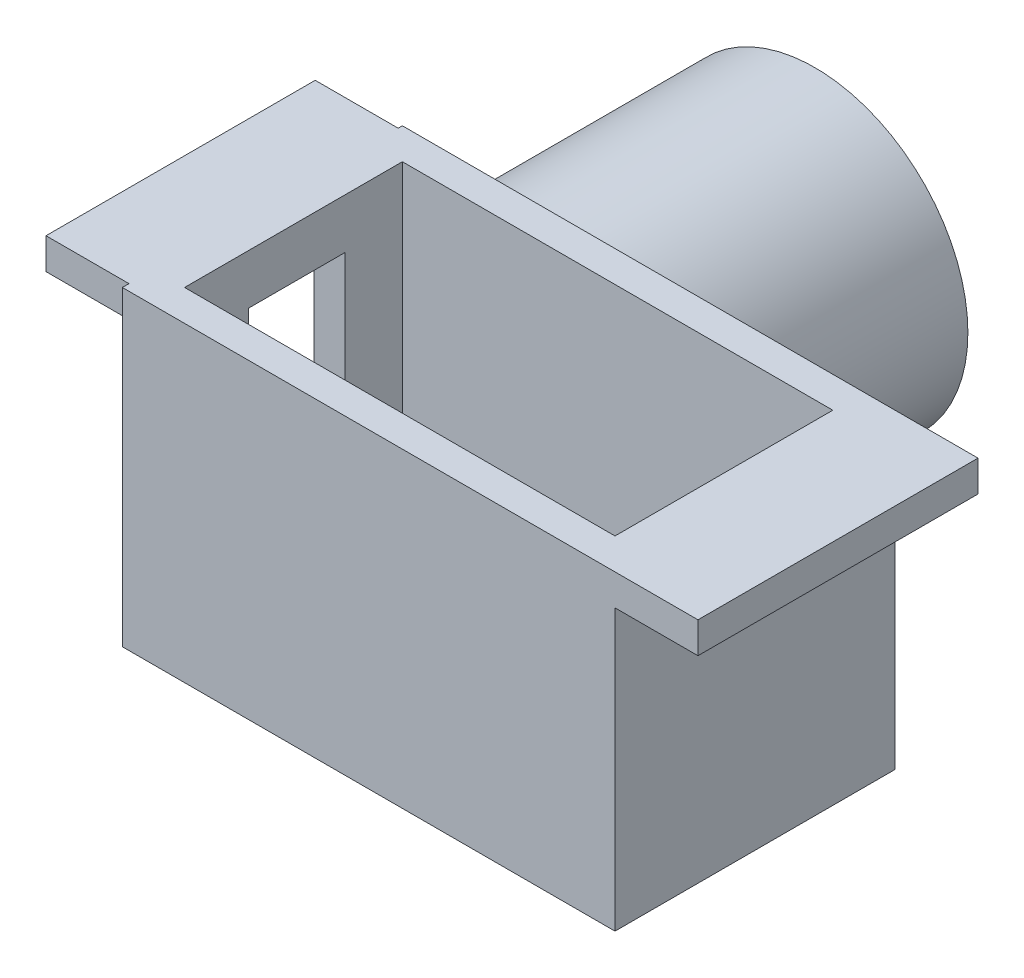
ISO-10303-21;
HEADER;
FILE_DESCRIPTION(('STEP AP214'),'2;1');
FILE_NAME('part.step','',(''),(''),'','','');
FILE_SCHEMA(('AUTOMOTIVE_DESIGN { 1 0 10303 214 1 1 1 1 }'));
ENDSEC;
DATA;
#1=APPLICATION_CONTEXT('core data for automotive mechanical design processes');
#2=APPLICATION_PROTOCOL_DEFINITION('international standard','automotive_design',2000,#1);
#3=PRODUCT_CONTEXT('',#1,'mechanical');
#4=PRODUCT('Part','Part','',(#3));
#5=PRODUCT_RELATED_PRODUCT_CATEGORY('part','',(#4));
#6=PRODUCT_DEFINITION_FORMATION('','',#4);
#7=PRODUCT_DEFINITION_CONTEXT('part definition',#1,'design');
#8=PRODUCT_DEFINITION('design','',#6,#7);
#9=PRODUCT_DEFINITION_SHAPE('','',#8);
#10=(LENGTH_UNIT() NAMED_UNIT(*) SI_UNIT(.MILLI.,.METRE.));
#11=(NAMED_UNIT(*) PLANE_ANGLE_UNIT() SI_UNIT($,.RADIAN.));
#12=(NAMED_UNIT(*) SI_UNIT($,.STERADIAN.) SOLID_ANGLE_UNIT());
#13=UNCERTAINTY_MEASURE_WITH_UNIT(LENGTH_MEASURE(1.E-05),#10,'distance_accuracy_value','');
#14=(GEOMETRIC_REPRESENTATION_CONTEXT(3) GLOBAL_UNCERTAINTY_ASSIGNED_CONTEXT((#13)) GLOBAL_UNIT_ASSIGNED_CONTEXT((#10,
#11,#12)) REPRESENTATION_CONTEXT('',''));
#15=CARTESIAN_POINT('',(0.,0.,0.));
#16=DIRECTION('',(0.,0.,1.));
#17=DIRECTION('',(1.,0.,0.));
#18=AXIS2_PLACEMENT_3D('',#15,#16,#17);
#19=CARTESIAN_POINT('',(58.4993412635073,-30.,-19.449225984621));
#20=DIRECTION('',(-1.,0.,0.));
#21=DIRECTION('',(0.,0.,1.));
#22=AXIS2_PLACEMENT_3D('',#19,#20,#21);
#23=PLANE('',#22);
#24=DIRECTION('',(0.,0.,-1.));
#25=VECTOR('',#24,1.);
#26=CARTESIAN_POINT('',(58.4993412635073,-3.,7.55077401537895));
#27=LINE('',#26,#25);
#28=CARTESIAN_POINT('',(58.4993412635073,-3.,7.55077401537895));
#29=VERTEX_POINT('',#28);
#30=CARTESIAN_POINT('',(58.4993412635073,-3.,-19.449225984621));
#31=VERTEX_POINT('',#30);
#32=EDGE_CURVE('E73',#29,#31,#27,.T.);
#33=ORIENTED_EDGE('',*,*,#32,.F.);
#34=DIRECTION('',(0.,1.,0.));
#35=VECTOR('',#34,1.);
#36=CARTESIAN_POINT('',(58.4993412635073,-30.,7.55077401537895));
#37=LINE('',#36,#35);
#38=CARTESIAN_POINT('',(58.4993412635073,-30.,7.55077401537895));
#39=VERTEX_POINT('',#38);
#40=EDGE_CURVE('E207',#39,#29,#37,.T.);
#41=ORIENTED_EDGE('',*,*,#40,.F.);
#42=DIRECTION('',(0.,0.,1.));
#43=VECTOR('',#42,1.);
#44=CARTESIAN_POINT('',(58.4993412635073,-30.,-19.449225984621));
#45=LINE('',#44,#43);
#46=CARTESIAN_POINT('',(58.4993412635073,-30.,-19.449225984621));
#47=VERTEX_POINT('',#46);
#48=EDGE_CURVE('E297',#47,#39,#45,.T.);
#49=ORIENTED_EDGE('',*,*,#48,.F.);
#50=DIRECTION('',(0.,1.,0.));
#51=VECTOR('',#50,1.);
#52=CARTESIAN_POINT('',(58.4993412635073,-30.,-19.449225984621));
#53=LINE('',#52,#51);
#54=EDGE_CURVE('E311',#47,#31,#53,.T.);
#55=ORIENTED_EDGE('',*,*,#54,.T.);
#56=EDGE_LOOP('',(#33,#41,#49,#55));
#57=FACE_BOUND('',#56,.T.);
#58=ADVANCED_FACE('F58',(#57),#23,.F.);
#59=CARTESIAN_POINT('',(0.,-30.,0.));
#60=DIRECTION('',(0.,1.,0.));
#61=DIRECTION('',(0.,0.,1.));
#62=AXIS2_PLACEMENT_3D('',#59,#60,#61);
#63=PLANE('',#62);
#64=DIRECTION('',(0.,0.,1.));
#65=VECTOR('',#64,1.);
#66=CARTESIAN_POINT('',(10.9993412635073,-30.,-19.449225984621));
#67=LINE('',#66,#65);
#68=CARTESIAN_POINT('',(10.9993412635073,-30.,-19.449225984621));
#69=VERTEX_POINT('',#68);
#70=CARTESIAN_POINT('',(10.9993412635073,-30.,7.55077401537895));
#71=VERTEX_POINT('',#70);
#72=EDGE_CURVE('E291',#69,#71,#67,.T.);
#73=ORIENTED_EDGE('',*,*,#72,.F.);
#74=DIRECTION('',(1.,0.,0.));
#75=VECTOR('',#74,1.);
#76=CARTESIAN_POINT('',(10.9993412635073,-30.,-19.449225984621));
#77=LINE('',#76,#75);
#78=EDGE_CURVE('E299',#69,#47,#77,.T.);
#79=ORIENTED_EDGE('',*,*,#78,.T.);
#80=ORIENTED_EDGE('',*,*,#48,.T.);
#81=DIRECTION('',(1.,0.,0.));
#82=VECTOR('',#81,1.);
#83=CARTESIAN_POINT('',(10.9993412635073,-30.,7.55077401537895));
#84=LINE('',#83,#82);
#85=EDGE_CURVE('E294',#71,#39,#84,.T.);
#86=ORIENTED_EDGE('',*,*,#85,.F.);
#87=EDGE_LOOP('',(#73,#79,#80,#86));
#88=FACE_BOUND('',#87,.T.);
#89=DIRECTION('',(0.,0.,1.));
#90=VECTOR('',#89,1.);
#91=CARTESIAN_POINT('',(55.4993412635073,-30.,0.));
#92=LINE('',#91,#90);
#93=CARTESIAN_POINT('',(55.4993412635073,-30.,-16.449225984621));
#94=VERTEX_POINT('',#93);
#95=CARTESIAN_POINT('',(55.4993412635073,-30.,4.55077401537895));
#96=VERTEX_POINT('',#95);
#97=EDGE_CURVE('E260',#94,#96,#92,.T.);
#98=ORIENTED_EDGE('',*,*,#97,.F.);
#99=DIRECTION('',(1.,0.,0.));
#100=VECTOR('',#99,1.);
#101=CARTESIAN_POINT('',(0.,-30.,-16.449225984621));
#102=LINE('',#101,#100);
#103=CARTESIAN_POINT('',(13.9993412635073,-30.,-16.449225984621));
#104=VERTEX_POINT('',#103);
#105=EDGE_CURVE('E262',#104,#94,#102,.T.);
#106=ORIENTED_EDGE('',*,*,#105,.F.);
#107=DIRECTION('',(0.,0.,1.));
#108=VECTOR('',#107,1.);
#109=CARTESIAN_POINT('',(13.9993412635073,-30.,0.));
#110=LINE('',#109,#108);
#111=CARTESIAN_POINT('',(13.9993412635073,-30.,4.55077401537895));
#112=VERTEX_POINT('',#111);
#113=EDGE_CURVE('E265',#104,#112,#110,.T.);
#114=ORIENTED_EDGE('',*,*,#113,.T.);
#115=DIRECTION('',(1.,0.,0.));
#116=VECTOR('',#115,1.);
#117=CARTESIAN_POINT('',(0.,-30.,4.55077401537895));
#118=LINE('',#117,#116);
#119=EDGE_CURVE('E268',#112,#96,#118,.T.);
#120=ORIENTED_EDGE('',*,*,#119,.T.);
#121=EDGE_LOOP('',(#98,#106,#114,#120));
#122=FACE_BOUND('',#121,.T.);
#123=ADVANCED_FACE('F354',(#88,#122),#63,.F.);
#124=CARTESIAN_POINT('',(0.,0.,0.));
#125=DIRECTION('',(0.,1.,0.));
#126=DIRECTION('',(0.,0.,1.));
#127=AXIS2_PLACEMENT_3D('',#124,#125,#126);
#128=PLANE('',#127);
#129=DIRECTION('',(0.,0.,1.));
#130=VECTOR('',#129,1.);
#131=CARTESIAN_POINT('',(10.9993412635073,0.,-19.449225984621));
#132=LINE('',#131,#130);
#133=CARTESIAN_POINT('',(10.9993412635073,0.,-19.449225984621));
#134=VERTEX_POINT('',#133);
#135=CARTESIAN_POINT('',(10.9993412635073,0.,-19.0455869261536));
#136=VERTEX_POINT('',#135);
#137=EDGE_CURVE('E302',#134,#136,#132,.T.);
#138=ORIENTED_EDGE('',*,*,#137,.T.);
#139=DIRECTION('',(1.,0.,0.));
#140=VECTOR('',#139,1.);
#141=CARTESIAN_POINT('',(2.99934126350726,0.,-19.0455869261536));
#142=LINE('',#141,#140);
#143=CARTESIAN_POINT('',(2.99934126350726,0.,-19.0455869261536));
#144=VERTEX_POINT('',#143);
#145=EDGE_CURVE('E224',#144,#136,#142,.T.);
#146=ORIENTED_EDGE('',*,*,#145,.F.);
#147=DIRECTION('',(0.,0.,-1.));
#148=VECTOR('',#147,1.);
#149=CARTESIAN_POINT('',(2.99934126350726,0.,-19.0455869261536));
#150=LINE('',#149,#148);
#151=CARTESIAN_POINT('',(2.99934126350727,0.,6.91116448949649));
#152=VERTEX_POINT('',#151);
#153=EDGE_CURVE('E223',#152,#144,#150,.T.);
#154=ORIENTED_EDGE('',*,*,#153,.F.);
#155=DIRECTION('',(1.,0.,0.));
#156=VECTOR('',#155,1.);
#157=CARTESIAN_POINT('',(2.99934126350727,0.,6.91116448949649));
#158=LINE('',#157,#156);
#159=CARTESIAN_POINT('',(10.9993412635073,0.,6.91116448949649));
#160=VERTEX_POINT('',#159);
#161=EDGE_CURVE('E231',#152,#160,#158,.T.);
#162=ORIENTED_EDGE('',*,*,#161,.T.);
#163=CARTESIAN_POINT('',(10.9993412635073,0.,7.55077401537895));
#164=VERTEX_POINT('',#163);
#165=EDGE_CURVE('E284',#160,#164,#132,.T.);
#166=ORIENTED_EDGE('',*,*,#165,.T.);
#167=DIRECTION('',(1.,0.,0.));
#168=VECTOR('',#167,1.);
#169=CARTESIAN_POINT('',(10.9993412635073,0.,7.55077401537895));
#170=LINE('',#169,#168);
#171=CARTESIAN_POINT('',(66.4993412635073,0.,7.55077401537895));
#172=VERTEX_POINT('',#171);
#173=EDGE_CURVE('E305',#164,#172,#170,.T.);
#174=ORIENTED_EDGE('',*,*,#173,.T.);
#175=DIRECTION('',(0.,0.,1.));
#176=VECTOR('',#175,1.);
#177=CARTESIAN_POINT('',(66.4993412635073,0.,7.55077401537895));
#178=LINE('',#177,#176);
#179=CARTESIAN_POINT('',(66.4993412635073,0.,-19.449225984621));
#180=VERTEX_POINT('',#179);
#181=EDGE_CURVE('E201',#180,#172,#178,.T.);
#182=ORIENTED_EDGE('',*,*,#181,.F.);
#183=DIRECTION('',(1.,0.,0.));
#184=VECTOR('',#183,1.);
#185=CARTESIAN_POINT('',(10.9993412635073,0.,-19.449225984621));
#186=LINE('',#185,#184);
#187=EDGE_CURVE('E295',#134,#180,#186,.T.);
#188=ORIENTED_EDGE('',*,*,#187,.F.);
#189=EDGE_LOOP('',(#138,#146,#154,#162,#166,#174,#182,#188));
#190=FACE_BOUND('',#189,.T.);
#191=DIRECTION('',(1.,0.,0.));
#192=VECTOR('',#191,1.);
#193=CARTESIAN_POINT('',(0.,0.,-16.449225984621));
#194=LINE('',#193,#192);
#195=CARTESIAN_POINT('',(13.9993412635073,0.,-16.449225984621));
#196=VERTEX_POINT('',#195);
#197=CARTESIAN_POINT('',(55.4993412635073,0.,-16.449225984621));
#198=VERTEX_POINT('',#197);
#199=EDGE_CURVE('E274',#196,#198,#194,.T.);
#200=ORIENTED_EDGE('',*,*,#199,.T.);
#201=DIRECTION('',(0.,0.,1.));
#202=VECTOR('',#201,1.);
#203=CARTESIAN_POINT('',(55.4993412635073,0.,0.));
#204=LINE('',#203,#202);
#205=CARTESIAN_POINT('',(55.4993412635073,0.,4.55077401537895));
#206=VERTEX_POINT('',#205);
#207=EDGE_CURVE('E253',#198,#206,#204,.T.);
#208=ORIENTED_EDGE('',*,*,#207,.T.);
#209=DIRECTION('',(1.,0.,0.));
#210=VECTOR('',#209,1.);
#211=CARTESIAN_POINT('',(0.,0.,4.55077401537895));
#212=LINE('',#211,#210);
#213=CARTESIAN_POINT('',(13.9993412635073,0.,4.55077401537895));
#214=VERTEX_POINT('',#213);
#215=EDGE_CURVE('E263',#214,#206,#212,.T.);
#216=ORIENTED_EDGE('',*,*,#215,.F.);
#217=DIRECTION('',(0.,0.,1.));
#218=VECTOR('',#217,1.);
#219=CARTESIAN_POINT('',(13.9993412635073,0.,0.));
#220=LINE('',#219,#218);
#221=EDGE_CURVE('E277',#196,#214,#220,.T.);
#222=ORIENTED_EDGE('',*,*,#221,.F.);
#223=EDGE_LOOP('',(#200,#208,#216,#222));
#224=FACE_BOUND('',#223,.T.);
#225=ADVANCED_FACE('F359',(#190,#224),#128,.T.);
#226=CARTESIAN_POINT('',(10.9993412635073,-30.,-19.449225984621));
#227=DIRECTION('',(-1.,0.,0.));
#228=DIRECTION('',(0.,0.,1.));
#229=AXIS2_PLACEMENT_3D('',#226,#227,#228);
#230=PLANE('',#229);
#231=DIRECTION('',(0.,-1.,0.));
#232=VECTOR('',#231,1.);
#233=CARTESIAN_POINT('',(10.9993412635073,0.,-19.0455869261536));
#234=LINE('',#233,#232);
#235=CARTESIAN_POINT('',(10.9993412635073,-3.,-19.0455869261536));
#236=VERTEX_POINT('',#235);
#237=EDGE_CURVE('E208',#136,#236,#234,.T.);
#238=ORIENTED_EDGE('',*,*,#237,.F.);
#239=ORIENTED_EDGE('',*,*,#137,.F.);
#240=DIRECTION('',(0.,1.,0.));
#241=VECTOR('',#240,1.);
#242=CARTESIAN_POINT('',(10.9993412635073,-30.,-19.449225984621));
#243=LINE('',#242,#241);
#244=EDGE_CURVE('E308',#69,#134,#243,.T.);
#245=ORIENTED_EDGE('',*,*,#244,.F.);
#246=ORIENTED_EDGE('',*,*,#72,.T.);
#247=DIRECTION('',(0.,1.,0.));
#248=VECTOR('',#247,1.);
#249=CARTESIAN_POINT('',(10.9993412635073,-30.,7.55077401537895));
#250=LINE('',#249,#248);
#251=EDGE_CURVE('E301',#71,#164,#250,.T.);
#252=ORIENTED_EDGE('',*,*,#251,.T.);
#253=ORIENTED_EDGE('',*,*,#165,.F.);
#254=DIRECTION('',(0.,1.,0.));
#255=VECTOR('',#254,1.);
#256=CARTESIAN_POINT('',(10.9993412635073,0.,6.91116448949648));
#257=LINE('',#256,#255);
#258=CARTESIAN_POINT('',(10.9993412635073,-3.,6.91116448949649));
#259=VERTEX_POINT('',#258);
#260=EDGE_CURVE('E219',#259,#160,#257,.T.);
#261=ORIENTED_EDGE('',*,*,#260,.F.);
#262=DIRECTION('',(0.,0.,1.));
#263=VECTOR('',#262,1.);
#264=CARTESIAN_POINT('',(10.9993412635073,-3.,-19.0455869261536));
#265=LINE('',#264,#263);
#266=EDGE_CURVE('E81',#236,#259,#265,.T.);
#267=ORIENTED_EDGE('',*,*,#266,.F.);
#268=EDGE_LOOP('',(#238,#239,#245,#246,#252,#253,#261,#267));
#269=FACE_BOUND('',#268,.T.);
#270=DIRECTION('',(0.,-1.,0.));
#271=VECTOR('',#270,1.);
#272=CARTESIAN_POINT('',(10.9993412635073,-4.81506246539772,-10.9135535675724));
#273=LINE('',#272,#271);
#274=CARTESIAN_POINT('',(10.9993412635073,-4.81506246539772,-10.9135535675724));
#275=VERTEX_POINT('',#274);
#276=CARTESIAN_POINT('',(10.9993412635073,-28.1887715017935,-10.9135535675724));
#277=VERTEX_POINT('',#276);
#278=EDGE_CURVE('E239',#275,#277,#273,.T.);
#279=ORIENTED_EDGE('',*,*,#278,.F.);
#280=DIRECTION('',(0.,0.,-1.));
#281=VECTOR('',#280,1.);
#282=CARTESIAN_POINT('',(10.9993412635073,-4.81506246539772,-10.9135535675724));
#283=LINE('',#282,#281);
#284=CARTESIAN_POINT('',(10.9993412635073,-4.81506246539772,-1.60543934953865));
#285=VERTEX_POINT('',#284);
#286=EDGE_CURVE('E247',#285,#275,#283,.T.);
#287=ORIENTED_EDGE('',*,*,#286,.F.);
#288=DIRECTION('',(0.,1.,0.));
#289=VECTOR('',#288,1.);
#290=CARTESIAN_POINT('',(10.9993412635073,-4.81506246539772,-1.60543934953865));
#291=LINE('',#290,#289);
#292=CARTESIAN_POINT('',(10.9993412635073,-28.1887715017935,-1.60543934953865));
#293=VERTEX_POINT('',#292);
#294=EDGE_CURVE('E244',#293,#285,#291,.T.);
#295=ORIENTED_EDGE('',*,*,#294,.F.);
#296=DIRECTION('',(0.,0.,1.));
#297=VECTOR('',#296,1.);
#298=CARTESIAN_POINT('',(10.9993412635073,-28.1887715017935,-10.9135535675724));
#299=LINE('',#298,#297);
#300=EDGE_CURVE('E241',#277,#293,#299,.T.);
#301=ORIENTED_EDGE('',*,*,#300,.F.);
#302=EDGE_LOOP('',(#279,#287,#295,#301));
#303=FACE_BOUND('',#302,.T.);
#304=ADVANCED_FACE('F60',(#269,#303),#230,.T.);
#305=CARTESIAN_POINT('',(10.9993412635073,-30.,-19.449225984621));
#306=DIRECTION('',(0.,0.,1.));
#307=DIRECTION('',(1.,0.,0.));
#308=AXIS2_PLACEMENT_3D('',#305,#306,#307);
#309=PLANE('',#308);
#310=CARTESIAN_POINT('',(25.7758938694058,-15.,-19.449225984621));
#311=DIRECTION('',(0.,0.,1.));
#312=DIRECTION('',(1.,0.,0.));
#313=AXIS2_PLACEMENT_3D('',#310,#311,#312);
#314=CIRCLE('',#313,14.75);
#315=CARTESIAN_POINT('',(40.5258938694058,-15.,-19.449225984621));
#316=VERTEX_POINT('',#315);
#317=EDGE_CURVE('E12',#316,#316,#314,.F.);
#318=ORIENTED_EDGE('',*,*,#317,.F.);
#319=EDGE_LOOP('',(#318));
#320=FACE_BOUND('',#319,.T.);
#321=ORIENTED_EDGE('',*,*,#187,.T.);
#322=DIRECTION('',(0.,1.,0.));
#323=VECTOR('',#322,1.);
#324=CARTESIAN_POINT('',(66.4993412635073,0.,-19.449225984621));
#325=LINE('',#324,#323);
#326=CARTESIAN_POINT('',(66.4993412635073,-3.,-19.449225984621));
#327=VERTEX_POINT('',#326);
#328=EDGE_CURVE('E194',#327,#180,#325,.T.);
#329=ORIENTED_EDGE('',*,*,#328,.F.);
#330=DIRECTION('',(-1.,0.,0.));
#331=VECTOR('',#330,1.);
#332=CARTESIAN_POINT('',(66.4993412635073,-3.,-19.449225984621));
#333=LINE('',#332,#331);
#334=EDGE_CURVE('E190',#327,#31,#333,.T.);
#335=ORIENTED_EDGE('',*,*,#334,.T.);
#336=ORIENTED_EDGE('',*,*,#54,.F.);
#337=ORIENTED_EDGE('',*,*,#78,.F.);
#338=ORIENTED_EDGE('',*,*,#244,.T.);
#339=EDGE_LOOP('',(#321,#329,#335,#336,#337,#338));
#340=FACE_BOUND('',#339,.T.);
#341=ADVANCED_FACE('F363',(#320,#340),#309,.F.);
#342=CARTESIAN_POINT('',(10.9993412635073,-30.,7.55077401537895));
#343=DIRECTION('',(0.,0.,1.));
#344=DIRECTION('',(1.,0.,0.));
#345=AXIS2_PLACEMENT_3D('',#342,#343,#344);
#346=PLANE('',#345);
#347=ORIENTED_EDGE('',*,*,#173,.F.);
#348=ORIENTED_EDGE('',*,*,#251,.F.);
#349=ORIENTED_EDGE('',*,*,#85,.T.);
#350=ORIENTED_EDGE('',*,*,#40,.T.);
#351=DIRECTION('',(-1.,0.,0.));
#352=VECTOR('',#351,1.);
#353=CARTESIAN_POINT('',(66.4993412635073,-3.,7.55077401537895));
#354=LINE('',#353,#352);
#355=CARTESIAN_POINT('',(66.4993412635073,-3.,7.55077401537895));
#356=VERTEX_POINT('',#355);
#357=EDGE_CURVE('E188',#356,#29,#354,.T.);
#358=ORIENTED_EDGE('',*,*,#357,.F.);
#359=DIRECTION('',(0.,-1.,0.));
#360=VECTOR('',#359,1.);
#361=CARTESIAN_POINT('',(66.4993412635073,0.,7.55077401537895));
#362=LINE('',#361,#360);
#363=EDGE_CURVE('E195',#172,#356,#362,.T.);
#364=ORIENTED_EDGE('',*,*,#363,.F.);
#365=EDGE_LOOP('',(#347,#348,#349,#350,#358,#364));
#366=FACE_BOUND('',#365,.T.);
#367=ADVANCED_FACE('F205',(#366),#346,.T.);
#368=CARTESIAN_POINT('',(55.4993412635073,-30.,0.));
#369=DIRECTION('',(-1.,0.,0.));
#370=DIRECTION('',(0.,0.,1.));
#371=AXIS2_PLACEMENT_3D('',#368,#369,#370);
#372=PLANE('',#371);
#373=ORIENTED_EDGE('',*,*,#207,.F.);
#374=DIRECTION('',(0.,1.,0.));
#375=VECTOR('',#374,1.);
#376=CARTESIAN_POINT('',(55.4993412635073,-30.,-16.449225984621));
#377=LINE('',#376,#375);
#378=EDGE_CURVE('E271',#94,#198,#377,.T.);
#379=ORIENTED_EDGE('',*,*,#378,.F.);
#380=ORIENTED_EDGE('',*,*,#97,.T.);
#381=DIRECTION('',(0.,1.,0.));
#382=VECTOR('',#381,1.);
#383=CARTESIAN_POINT('',(55.4993412635073,-30.,4.55077401537895));
#384=LINE('',#383,#382);
#385=EDGE_CURVE('E282',#96,#206,#384,.T.);
#386=ORIENTED_EDGE('',*,*,#385,.T.);
#387=EDGE_LOOP('',(#373,#379,#380,#386));
#388=FACE_BOUND('',#387,.T.);
#389=ADVANCED_FACE('F366',(#388),#372,.T.);
#390=CARTESIAN_POINT('',(0.,-30.,4.55077401537895));
#391=DIRECTION('',(0.,0.,1.));
#392=DIRECTION('',(1.,0.,0.));
#393=AXIS2_PLACEMENT_3D('',#390,#391,#392);
#394=PLANE('',#393);
#395=ORIENTED_EDGE('',*,*,#215,.T.);
#396=ORIENTED_EDGE('',*,*,#385,.F.);
#397=ORIENTED_EDGE('',*,*,#119,.F.);
#398=DIRECTION('',(0.,1.,0.));
#399=VECTOR('',#398,1.);
#400=CARTESIAN_POINT('',(13.9993412635073,-30.,4.55077401537895));
#401=LINE('',#400,#399);
#402=EDGE_CURVE('E285',#112,#214,#401,.T.);
#403=ORIENTED_EDGE('',*,*,#402,.T.);
#404=EDGE_LOOP('',(#395,#396,#397,#403));
#405=FACE_BOUND('',#404,.T.);
#406=ADVANCED_FACE('F371',(#405),#394,.F.);
#407=CARTESIAN_POINT('',(13.9993412635073,-30.,0.));
#408=DIRECTION('',(-1.,0.,0.));
#409=DIRECTION('',(0.,0.,1.));
#410=AXIS2_PLACEMENT_3D('',#407,#408,#409);
#411=PLANE('',#410);
#412=DIRECTION('',(0.,0.,-1.));
#413=VECTOR('',#412,1.);
#414=CARTESIAN_POINT('',(13.9993412635073,-4.81506246539772,0.));
#415=LINE('',#414,#413);
#416=CARTESIAN_POINT('',(13.9993412635073,-4.81506246539772,-1.60543934953865));
#417=VERTEX_POINT('',#416);
#418=CARTESIAN_POINT('',(13.9993412635073,-4.81506246539772,-10.9135535675724));
#419=VERTEX_POINT('',#418);
#420=EDGE_CURVE('E321',#417,#419,#415,.T.);
#421=ORIENTED_EDGE('',*,*,#420,.T.);
#422=DIRECTION('',(0.,-1.,0.));
#423=VECTOR('',#422,1.);
#424=CARTESIAN_POINT('',(13.9993412635073,-30.,-10.9135535675724));
#425=LINE('',#424,#423);
#426=CARTESIAN_POINT('',(13.9993412635073,-28.1887715017935,-10.9135535675724));
#427=VERTEX_POINT('',#426);
#428=EDGE_CURVE('E66',#419,#427,#425,.T.);
#429=ORIENTED_EDGE('',*,*,#428,.T.);
#430=DIRECTION('',(0.,0.,1.));
#431=VECTOR('',#430,1.);
#432=CARTESIAN_POINT('',(13.9993412635073,-28.1887715017935,0.));
#433=LINE('',#432,#431);
#434=CARTESIAN_POINT('',(13.9993412635073,-28.1887715017935,-1.60543934953865));
#435=VERTEX_POINT('',#434);
#436=EDGE_CURVE('E310',#427,#435,#433,.T.);
#437=ORIENTED_EDGE('',*,*,#436,.T.);
#438=DIRECTION('',(0.,1.,0.));
#439=VECTOR('',#438,1.);
#440=CARTESIAN_POINT('',(13.9993412635073,-30.,-1.60543934953865));
#441=LINE('',#440,#439);
#442=EDGE_CURVE('E318',#435,#417,#441,.T.);
#443=ORIENTED_EDGE('',*,*,#442,.T.);
#444=EDGE_LOOP('',(#421,#429,#437,#443));
#445=FACE_BOUND('',#444,.T.);
#446=ORIENTED_EDGE('',*,*,#221,.T.);
#447=ORIENTED_EDGE('',*,*,#402,.F.);
#448=ORIENTED_EDGE('',*,*,#113,.F.);
#449=DIRECTION('',(0.,1.,0.));
#450=VECTOR('',#449,1.);
#451=CARTESIAN_POINT('',(13.9993412635073,-30.,-16.449225984621));
#452=LINE('',#451,#450);
#453=EDGE_CURVE('E287',#104,#196,#452,.T.);
#454=ORIENTED_EDGE('',*,*,#453,.T.);
#455=EDGE_LOOP('',(#446,#447,#448,#454));
#456=FACE_BOUND('',#455,.T.);
#457=ADVANCED_FACE('F325',(#445,#456),#411,.F.);
#458=CARTESIAN_POINT('',(0.,-30.,-16.449225984621));
#459=DIRECTION('',(0.,0.,1.));
#460=DIRECTION('',(1.,0.,0.));
#461=AXIS2_PLACEMENT_3D('',#458,#459,#460);
#462=PLANE('',#461);
#463=ORIENTED_EDGE('',*,*,#199,.F.);
#464=ORIENTED_EDGE('',*,*,#453,.F.);
#465=ORIENTED_EDGE('',*,*,#105,.T.);
#466=ORIENTED_EDGE('',*,*,#378,.T.);
#467=EDGE_LOOP('',(#463,#464,#465,#466));
#468=FACE_BOUND('',#467,.T.);
#469=ADVANCED_FACE('F463',(#468),#462,.T.);
#470=CARTESIAN_POINT('',(40.9993412635073,-4.81506246539772,-10.9135535675724));
#471=DIRECTION('',(0.,0.,-1.));
#472=DIRECTION('',(0.,1.,0.));
#473=AXIS2_PLACEMENT_3D('',#470,#471,#472);
#474=PLANE('',#473);
#475=DIRECTION('',(-1.,0.,0.));
#476=VECTOR('',#475,1.);
#477=CARTESIAN_POINT('',(40.9993412635073,-4.81506246539772,-10.9135535675724));
#478=LINE('',#477,#476);
#479=EDGE_CURVE('E251',#419,#275,#478,.T.);
#480=ORIENTED_EDGE('',*,*,#479,.T.);
#481=ORIENTED_EDGE('',*,*,#278,.T.);
#482=DIRECTION('',(-1.,0.,0.));
#483=VECTOR('',#482,1.);
#484=CARTESIAN_POINT('',(40.9993412635073,-28.1887715017935,-10.9135535675724));
#485=LINE('',#484,#483);
#486=EDGE_CURVE('E250',#427,#277,#485,.T.);
#487=ORIENTED_EDGE('',*,*,#486,.F.);
#488=ORIENTED_EDGE('',*,*,#428,.F.);
#489=EDGE_LOOP('',(#480,#481,#487,#488));
#490=FACE_BOUND('',#489,.T.);
#491=ADVANCED_FACE('F330',(#490),#474,.F.);
#492=CARTESIAN_POINT('',(40.9993412635073,-4.81506246539772,-10.9135535675724));
#493=DIRECTION('',(0.,1.,0.));
#494=DIRECTION('',(0.,0.,1.));
#495=AXIS2_PLACEMENT_3D('',#492,#493,#494);
#496=PLANE('',#495);
#497=DIRECTION('',(-1.,0.,0.));
#498=VECTOR('',#497,1.);
#499=CARTESIAN_POINT('',(40.9993412635073,-4.81506246539772,-1.60543934953866));
#500=LINE('',#499,#498);
#501=EDGE_CURVE('E254',#417,#285,#500,.T.);
#502=ORIENTED_EDGE('',*,*,#501,.T.);
#503=ORIENTED_EDGE('',*,*,#286,.T.);
#504=ORIENTED_EDGE('',*,*,#479,.F.);
#505=ORIENTED_EDGE('',*,*,#420,.F.);
#506=EDGE_LOOP('',(#502,#503,#504,#505));
#507=FACE_BOUND('',#506,.T.);
#508=ADVANCED_FACE('F332',(#507),#496,.F.);
#509=CARTESIAN_POINT('',(40.9993412635073,-4.81506246539772,-1.60543934953866));
#510=DIRECTION('',(0.,0.,1.));
#511=DIRECTION('',(0.,-1.,0.));
#512=AXIS2_PLACEMENT_3D('',#509,#510,#511);
#513=PLANE('',#512);
#514=DIRECTION('',(-1.,0.,0.));
#515=VECTOR('',#514,1.);
#516=CARTESIAN_POINT('',(40.9993412635073,-28.1887715017935,-1.60543934953865));
#517=LINE('',#516,#515);
#518=EDGE_CURVE('E256',#435,#293,#517,.T.);
#519=ORIENTED_EDGE('',*,*,#518,.T.);
#520=ORIENTED_EDGE('',*,*,#294,.T.);
#521=ORIENTED_EDGE('',*,*,#501,.F.);
#522=ORIENTED_EDGE('',*,*,#442,.F.);
#523=EDGE_LOOP('',(#519,#520,#521,#522));
#524=FACE_BOUND('',#523,.T.);
#525=ADVANCED_FACE('F343',(#524),#513,.F.);
#526=CARTESIAN_POINT('',(40.9993412635073,-28.1887715017935,-10.9135535675724));
#527=DIRECTION('',(0.,-1.,0.));
#528=DIRECTION('',(0.,0.,-1.));
#529=AXIS2_PLACEMENT_3D('',#526,#527,#528);
#530=PLANE('',#529);
#531=ORIENTED_EDGE('',*,*,#486,.T.);
#532=ORIENTED_EDGE('',*,*,#300,.T.);
#533=ORIENTED_EDGE('',*,*,#518,.F.);
#534=ORIENTED_EDGE('',*,*,#436,.F.);
#535=EDGE_LOOP('',(#531,#532,#533,#534));
#536=FACE_BOUND('',#535,.T.);
#537=ADVANCED_FACE('F340',(#536),#530,.F.);
#538=CARTESIAN_POINT('',(2.99934126350726,0.,-19.0455869261536));
#539=DIRECTION('',(0.,0.,1.));
#540=DIRECTION('',(1.,0.,0.));
#541=AXIS2_PLACEMENT_3D('',#538,#539,#540);
#542=PLANE('',#541);
#543=ORIENTED_EDGE('',*,*,#237,.T.);
#544=DIRECTION('',(1.,0.,0.));
#545=VECTOR('',#544,1.);
#546=CARTESIAN_POINT('',(2.99934126350726,-3.,-19.0455869261536));
#547=LINE('',#546,#545);
#548=CARTESIAN_POINT('',(2.99934126350726,-3.,-19.0455869261536));
#549=VERTEX_POINT('',#548);
#550=EDGE_CURVE('E237',#549,#236,#547,.T.);
#551=ORIENTED_EDGE('',*,*,#550,.F.);
#552=DIRECTION('',(0.,-1.,0.));
#553=VECTOR('',#552,1.);
#554=CARTESIAN_POINT('',(2.99934126350726,0.,-19.0455869261536));
#555=LINE('',#554,#553);
#556=EDGE_CURVE('E215',#144,#549,#555,.T.);
#557=ORIENTED_EDGE('',*,*,#556,.F.);
#558=ORIENTED_EDGE('',*,*,#145,.T.);
#559=EDGE_LOOP('',(#543,#551,#557,#558));
#560=FACE_BOUND('',#559,.T.);
#561=ADVANCED_FACE('F350',(#560),#542,.F.);
#562=CARTESIAN_POINT('',(2.99934126350726,-3.,-19.0455869261536));
#563=DIRECTION('',(0.,1.,0.));
#564=DIRECTION('',(0.,0.,1.));
#565=AXIS2_PLACEMENT_3D('',#562,#563,#564);
#566=PLANE('',#565);
#567=ORIENTED_EDGE('',*,*,#266,.T.);
#568=DIRECTION('',(1.,0.,0.));
#569=VECTOR('',#568,1.);
#570=CARTESIAN_POINT('',(2.99934126350727,-3.,6.91116448949649));
#571=LINE('',#570,#569);
#572=CARTESIAN_POINT('',(2.99934126350727,-3.,6.91116448949649));
#573=VERTEX_POINT('',#572);
#574=EDGE_CURVE('E234',#573,#259,#571,.T.);
#575=ORIENTED_EDGE('',*,*,#574,.F.);
#576=DIRECTION('',(0.,0.,1.));
#577=VECTOR('',#576,1.);
#578=CARTESIAN_POINT('',(2.99934126350726,-3.,-19.0455869261536));
#579=LINE('',#578,#577);
#580=EDGE_CURVE('E218',#549,#573,#579,.T.);
#581=ORIENTED_EDGE('',*,*,#580,.F.);
#582=ORIENTED_EDGE('',*,*,#550,.T.);
#583=EDGE_LOOP('',(#567,#575,#581,#582));
#584=FACE_BOUND('',#583,.T.);
#585=ADVANCED_FACE('F427',(#584),#566,.F.);
#586=CARTESIAN_POINT('',(2.99934126350727,0.,6.91116448949649));
#587=DIRECTION('',(0.,0.,-1.));
#588=DIRECTION('',(0.,1.,0.));
#589=AXIS2_PLACEMENT_3D('',#586,#587,#588);
#590=PLANE('',#589);
#591=ORIENTED_EDGE('',*,*,#260,.T.);
#592=ORIENTED_EDGE('',*,*,#161,.F.);
#593=DIRECTION('',(0.,1.,0.));
#594=VECTOR('',#593,1.);
#595=CARTESIAN_POINT('',(2.99934126350727,0.,6.91116448949649));
#596=LINE('',#595,#594);
#597=EDGE_CURVE('E221',#573,#152,#596,.T.);
#598=ORIENTED_EDGE('',*,*,#597,.F.);
#599=ORIENTED_EDGE('',*,*,#574,.T.);
#600=EDGE_LOOP('',(#591,#592,#598,#599));
#601=FACE_BOUND('',#600,.T.);
#602=ADVANCED_FACE('F423',(#601),#590,.F.);
#603=CARTESIAN_POINT('',(2.99934126350727,0.,0.));
#604=DIRECTION('',(-1.,0.,0.));
#605=DIRECTION('',(0.,0.,1.));
#606=AXIS2_PLACEMENT_3D('',#603,#604,#605);
#607=PLANE('',#606);
#608=ORIENTED_EDGE('',*,*,#556,.T.);
#609=ORIENTED_EDGE('',*,*,#580,.T.);
#610=ORIENTED_EDGE('',*,*,#597,.T.);
#611=ORIENTED_EDGE('',*,*,#153,.T.);
#612=EDGE_LOOP('',(#608,#609,#610,#611));
#613=FACE_BOUND('',#612,.T.);
#614=ADVANCED_FACE('F420',(#613),#607,.T.);
#615=CARTESIAN_POINT('',(66.4993412635073,-3.,7.55077401537895));
#616=DIRECTION('',(0.,1.,0.));
#617=DIRECTION('',(0.,0.,1.));
#618=AXIS2_PLACEMENT_3D('',#615,#616,#617);
#619=PLANE('',#618);
#620=ORIENTED_EDGE('',*,*,#32,.T.);
#621=ORIENTED_EDGE('',*,*,#334,.F.);
#622=DIRECTION('',(0.,0.,-1.));
#623=VECTOR('',#622,1.);
#624=CARTESIAN_POINT('',(66.4993412635073,-3.,7.55077401537895));
#625=LINE('',#624,#623);
#626=EDGE_CURVE('E184',#356,#327,#625,.T.);
#627=ORIENTED_EDGE('',*,*,#626,.F.);
#628=ORIENTED_EDGE('',*,*,#357,.T.);
#629=EDGE_LOOP('',(#620,#621,#627,#628));
#630=FACE_BOUND('',#629,.T.);
#631=ADVANCED_FACE('F186',(#630),#619,.F.);
#632=CARTESIAN_POINT('',(66.4993412635073,0.,0.));
#633=DIRECTION('',(1.,0.,0.));
#634=DIRECTION('',(0.,0.,-1.));
#635=AXIS2_PLACEMENT_3D('',#632,#633,#634);
#636=PLANE('',#635);
#637=ORIENTED_EDGE('',*,*,#363,.T.);
#638=ORIENTED_EDGE('',*,*,#626,.T.);
#639=ORIENTED_EDGE('',*,*,#328,.T.);
#640=ORIENTED_EDGE('',*,*,#181,.T.);
#641=EDGE_LOOP('',(#637,#638,#639,#640));
#642=FACE_BOUND('',#641,.T.);
#643=ADVANCED_FACE('F199',(#642),#636,.T.);
#644=CARTESIAN_POINT('',(25.7758938694058,-15.,-44.449225984621));
#645=DIRECTION('',(0.,0.,1.));
#646=DIRECTION('',(1.,0.,0.));
#647=AXIS2_PLACEMENT_3D('',#644,#645,#646);
#648=CYLINDRICAL_SURFACE('',#647,12.75);
#649=CARTESIAN_POINT('',(25.7758938694058,-15.,-44.449225984621));
#650=DIRECTION('',(0.,0.,-1.));
#651=DIRECTION('',(-1.,0.,0.));
#652=AXIS2_PLACEMENT_3D('',#649,#650,#651);
#653=CIRCLE('',#652,12.75);
#654=CARTESIAN_POINT('',(13.0258938694058,-15.,-44.449225984621));
#655=VERTEX_POINT('',#654);
#656=EDGE_CURVE('E394',#655,#655,#653,.T.);
#657=ORIENTED_EDGE('',*,*,#656,.T.);
#658=EDGE_LOOP('',(#657));
#659=FACE_BOUND('',#658,.T.);
#660=CARTESIAN_POINT('',(25.7758938694058,-15.,-19.449225984621));
#661=DIRECTION('',(0.,0.,-1.));
#662=DIRECTION('',(-1.,0.,0.));
#663=AXIS2_PLACEMENT_3D('',#660,#661,#662);
#664=CIRCLE('',#663,12.75);
#665=CARTESIAN_POINT('',(13.0258938694058,-15.,-19.449225984621));
#666=VERTEX_POINT('',#665);
#667=EDGE_CURVE('E392',#666,#666,#664,.T.);
#668=ORIENTED_EDGE('',*,*,#667,.F.);
#669=EDGE_LOOP('',(#668));
#670=FACE_BOUND('',#669,.T.);
#671=ADVANCED_FACE('F408',(#659,#670),#648,.F.);
#672=CARTESIAN_POINT('',(25.7758938694058,-15.,-44.449225984621));
#673=DIRECTION('',(0.,0.,1.));
#674=DIRECTION('',(1.,0.,0.));
#675=AXIS2_PLACEMENT_3D('',#672,#673,#674);
#676=CYLINDRICAL_SURFACE('',#675,14.75);
#677=CARTESIAN_POINT('',(25.7758938694058,-15.,-44.449225984621));
#678=DIRECTION('',(0.,0.,-1.));
#679=DIRECTION('',(-1.,0.,0.));
#680=AXIS2_PLACEMENT_3D('',#677,#678,#679);
#681=CIRCLE('',#680,14.75);
#682=CARTESIAN_POINT('',(11.0258938694058,-15.,-44.449225984621));
#683=VERTEX_POINT('',#682);
#684=EDGE_CURVE('E397',#683,#683,#681,.T.);
#685=ORIENTED_EDGE('',*,*,#684,.F.);
#686=EDGE_LOOP('',(#685));
#687=FACE_BOUND('',#686,.T.);
#688=ORIENTED_EDGE('',*,*,#317,.T.);
#689=EDGE_LOOP('',(#688));
#690=FACE_BOUND('',#689,.T.);
#691=ADVANCED_FACE('F387',(#687,#690),#676,.T.);
#692=CARTESIAN_POINT('',(0.,0.,-44.449225984621));
#693=DIRECTION('',(0.,0.,-1.));
#694=DIRECTION('',(-1.,0.,0.));
#695=AXIS2_PLACEMENT_3D('',#692,#693,#694);
#696=PLANE('',#695);
#697=ORIENTED_EDGE('',*,*,#656,.F.);
#698=EDGE_LOOP('',(#697));
#699=FACE_BOUND('',#698,.T.);
#700=ORIENTED_EDGE('',*,*,#684,.T.);
#701=EDGE_LOOP('',(#700));
#702=FACE_BOUND('',#701,.T.);
#703=ADVANCED_FACE('F382',(#699,#702),#696,.T.);
#704=ORIENTED_EDGE('',*,*,#667,.T.);
#705=EDGE_LOOP('',(#704));
#706=FACE_BOUND('',#705,.T.);
#707=ADVANCED_FACE('F375',(#706),#309,.F.);
#708=CLOSED_SHELL('',(#58,#123,#225,#304,#341,#367,#389,#406,#457,#469,#491,#508,#525,#537,#561,
#585,#602,#614,#631,#643,#671,#691,#703,#707));
#709=MANIFOLD_SOLID_BREP('B2',#708);
#710=ADVANCED_BREP_SHAPE_REPRESENTATION('',(#18,#709),#14);
#711=SHAPE_DEFINITION_REPRESENTATION(#9,#710);
ENDSEC;
END-ISO-10303-21;
